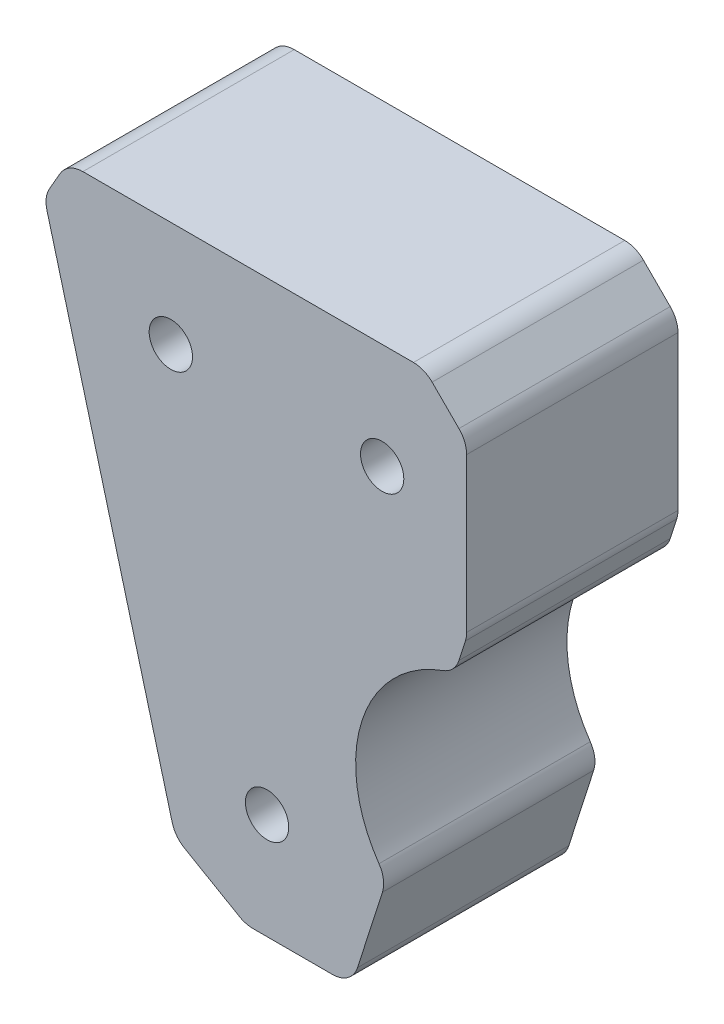
ISO-10303-21;
HEADER;
FILE_DESCRIPTION(('STEP AP214'),'2;1');
FILE_NAME('part.step','',(''),(''),'','','');
FILE_SCHEMA(('AUTOMOTIVE_DESIGN { 1 0 10303 214 1 1 1 1 }'));
ENDSEC;
DATA;
#1=APPLICATION_CONTEXT('core data for automotive mechanical design processes');
#2=APPLICATION_PROTOCOL_DEFINITION('international standard','automotive_design',2000,#1);
#3=PRODUCT_CONTEXT('',#1,'mechanical');
#4=PRODUCT('Part','Part','',(#3));
#5=PRODUCT_RELATED_PRODUCT_CATEGORY('part','',(#4));
#6=PRODUCT_DEFINITION_FORMATION('','',#4);
#7=PRODUCT_DEFINITION_CONTEXT('part definition',#1,'design');
#8=PRODUCT_DEFINITION('design','',#6,#7);
#9=PRODUCT_DEFINITION_SHAPE('','',#8);
#10=(LENGTH_UNIT() NAMED_UNIT(*) SI_UNIT(.MILLI.,.METRE.));
#11=(NAMED_UNIT(*) PLANE_ANGLE_UNIT() SI_UNIT($,.RADIAN.));
#12=(NAMED_UNIT(*) SI_UNIT($,.STERADIAN.) SOLID_ANGLE_UNIT());
#13=UNCERTAINTY_MEASURE_WITH_UNIT(LENGTH_MEASURE(1.E-05),#10,'distance_accuracy_value','');
#14=(GEOMETRIC_REPRESENTATION_CONTEXT(3) GLOBAL_UNCERTAINTY_ASSIGNED_CONTEXT((#13)) GLOBAL_UNIT_ASSIGNED_CONTEXT((#10,
#11,#12)) REPRESENTATION_CONTEXT('',''));
#15=CARTESIAN_POINT('',(0.,0.,0.));
#16=DIRECTION('',(0.,0.,1.));
#17=DIRECTION('',(1.,0.,0.));
#18=AXIS2_PLACEMENT_3D('',#15,#16,#17);
#19=CARTESIAN_POINT('',(28.,-10.,10.));
#20=DIRECTION('',(-0.95234502441364,0.305022875330005,0.));
#21=DIRECTION('',(-0.305022875330005,-0.95234502441364,0.));
#22=AXIS2_PLACEMENT_3D('',#19,#20,#21);
#23=PLANE('',#22);
#24=DIRECTION('',(0.305022875330005,0.95234502441364,0.));
#25=VECTOR('',#24,1.);
#26=CARTESIAN_POINT('',(28.,-10.,-10.));
#27=LINE('',#26,#25);
#28=CARTESIAN_POINT('',(17.6667513277127,-42.262557188325,-10.));
#29=VERTEX_POINT('',#28);
#30=CARTESIAN_POINT('',(20.0249138794989,-34.8998819446324,-10.));
#31=VERTEX_POINT('',#30);
#32=EDGE_CURVE('E191',#29,#31,#27,.T.);
#33=ORIENTED_EDGE('',*,*,#32,.T.);
#34=DIRECTION('',(0.,0.,1.));
#35=VECTOR('',#34,1.);
#36=CARTESIAN_POINT('',(20.0249138794989,-34.8998819446324,10.));
#37=LINE('',#36,#35);
#38=CARTESIAN_POINT('',(20.0249138794989,-34.8998819446324,10.));
#39=VERTEX_POINT('',#38);
#40=EDGE_CURVE('E195',#31,#39,#37,.T.);
#41=ORIENTED_EDGE('',*,*,#40,.T.);
#42=DIRECTION('',(0.305022875330005,0.95234502441364,0.));
#43=VECTOR('',#42,1.);
#44=CARTESIAN_POINT('',(28.,-10.,10.));
#45=LINE('',#44,#43);
#46=CARTESIAN_POINT('',(17.6667513277127,-42.262557188325,10.));
#47=VERTEX_POINT('',#46);
#48=EDGE_CURVE('E194',#47,#39,#45,.T.);
#49=ORIENTED_EDGE('',*,*,#48,.F.);
#50=DIRECTION('',(0.,0.,-1.));
#51=VECTOR('',#50,1.);
#52=CARTESIAN_POINT('',(17.6667513277127,-42.262557188325,10.));
#53=LINE('',#52,#51);
#54=EDGE_CURVE('E180',#47,#29,#53,.T.);
#55=ORIENTED_EDGE('',*,*,#54,.T.);
#56=EDGE_LOOP('',(#33,#41,#49,#55));
#57=FACE_BOUND('',#56,.T.);
#58=ADVANCED_FACE('F37',(#57),#23,.F.);
#59=CARTESIAN_POINT('',(0.,0.,10.));
#60=DIRECTION('',(0.,0.,1.));
#61=DIRECTION('',(1.,0.,0.));
#62=AXIS2_PLACEMENT_3D('',#59,#60,#61);
#63=PLANE('',#62);
#64=ORIENTED_EDGE('',*,*,#48,.T.);
#65=CARTESIAN_POINT('',(17.6440513184648,-34.1373247563074,10.));
#66=DIRECTION('',(0.,0.,1.));
#67=DIRECTION('',(1.,0.,0.));
#68=AXIS2_PLACEMENT_3D('',#65,#66,#67);
#69=CIRCLE('',#68,2.5);
#70=CARTESIAN_POINT('',(19.7019993228416,-32.7178706319054,10.));
#71=VERTEX_POINT('',#70);
#72=EDGE_CURVE('E257',#39,#71,#69,.T.);
#73=ORIENTED_EDGE('',*,*,#72,.T.);
#74=CARTESIAN_POINT('',(29.9917393447254,-25.6206000098957,10.));
#75=DIRECTION('',(0.,0.,1.));
#76=DIRECTION('',(1.,0.,0.));
#77=AXIS2_PLACEMENT_3D('',#74,#75,#76);
#78=CIRCLE('',#77,12.5);
#79=CARTESIAN_POINT('',(25.7400225826702,-13.865902881715,10.));
#80=VERTEX_POINT('',#79);
#81=EDGE_CURVE('E418',#80,#71,#78,.T.);
#82=ORIENTED_EDGE('',*,*,#81,.F.);
#83=CARTESIAN_POINT('',(24.8896792302592,-11.5149634560789,10.));
#84=DIRECTION('',(0.,0.,1.));
#85=DIRECTION('',(1.,0.,0.));
#86=AXIS2_PLACEMENT_3D('',#83,#84,#85);
#87=CIRCLE('',#86,2.5);
#88=CARTESIAN_POINT('',(27.2705417912933,-12.2775206444039,10.));
#89=VERTEX_POINT('',#88);
#90=EDGE_CURVE('E255',#80,#89,#87,.T.);
#91=ORIENTED_EDGE('',*,*,#90,.T.);
#92=CARTESIAN_POINT('',(27.8808625610341,-10.3719719286555,10.));
#93=VERTEX_POINT('',#92);
#94=EDGE_CURVE('E221',#89,#93,#45,.T.);
#95=ORIENTED_EDGE('',*,*,#94,.T.);
#96=CARTESIAN_POINT('',(25.5,-9.60941474033052,10.));
#97=DIRECTION('',(0.,0.,1.));
#98=DIRECTION('',(1.,0.,0.));
#99=AXIS2_PLACEMENT_3D('',#96,#97,#98);
#100=CIRCLE('',#99,2.5);
#101=CARTESIAN_POINT('',(28.,-9.60941474033052,10.));
#102=VERTEX_POINT('',#101);
#103=EDGE_CURVE('E253',#93,#102,#100,.T.);
#104=ORIENTED_EDGE('',*,*,#103,.T.);
#105=DIRECTION('',(0.,1.,0.));
#106=VECTOR('',#105,1.);
#107=CARTESIAN_POINT('',(28.,-10.,10.));
#108=LINE('',#107,#106);
#109=CARTESIAN_POINT('',(28.,4.96446609406727,10.));
#110=VERTEX_POINT('',#109);
#111=EDGE_CURVE('E324',#102,#110,#108,.T.);
#112=ORIENTED_EDGE('',*,*,#111,.T.);
#113=CARTESIAN_POINT('',(25.5,4.96446609406727,10.));
#114=DIRECTION('',(0.,0.,1.));
#115=DIRECTION('',(1.,0.,0.));
#116=AXIS2_PLACEMENT_3D('',#113,#114,#115);
#117=CIRCLE('',#116,2.5);
#118=CARTESIAN_POINT('',(27.2677669529664,6.73223304703364,10.));
#119=VERTEX_POINT('',#118);
#120=EDGE_CURVE('E241',#110,#119,#117,.T.);
#121=ORIENTED_EDGE('',*,*,#120,.T.);
#122=DIRECTION('',(0.707106781186548,-0.707106781186547,0.));
#123=VECTOR('',#122,1.);
#124=CARTESIAN_POINT('',(17.,17.,10.));
#125=LINE('',#124,#123);
#126=CARTESIAN_POINT('',(24.7322330470336,9.26776695296637,10.));
#127=VERTEX_POINT('',#126);
#128=EDGE_CURVE('E196',#119,#127,#125,.F.);
#129=ORIENTED_EDGE('',*,*,#128,.T.);
#130=CARTESIAN_POINT('',(22.9644660940673,7.5,10.));
#131=DIRECTION('',(0.,0.,1.));
#132=DIRECTION('',(1.,0.,0.));
#133=AXIS2_PLACEMENT_3D('',#130,#131,#132);
#134=CIRCLE('',#133,2.5);
#135=CARTESIAN_POINT('',(22.9644660940673,10.,10.));
#136=VERTEX_POINT('',#135);
#137=EDGE_CURVE('E243',#127,#136,#134,.T.);
#138=ORIENTED_EDGE('',*,*,#137,.T.);
#139=DIRECTION('',(-1.,0.,0.));
#140=VECTOR('',#139,1.);
#141=CARTESIAN_POINT('',(-13.032253728412,10.,10.));
#142=LINE('',#141,#140);
#143=CARTESIAN_POINT('',(-8.32289173172706,10.,10.));
#144=VERTEX_POINT('',#143);
#145=EDGE_CURVE('E330',#136,#144,#142,.T.);
#146=ORIENTED_EDGE('',*,*,#145,.T.);
#147=CARTESIAN_POINT('',(-8.32289173172706,7.5,10.));
#148=DIRECTION('',(0.,0.,1.));
#149=DIRECTION('',(1.,0.,0.));
#150=AXIS2_PLACEMENT_3D('',#147,#148,#149);
#151=CIRCLE('',#150,2.5);
#152=CARTESIAN_POINT('',(-10.4879552411882,8.75,10.));
#153=VERTEX_POINT('',#152);
#154=EDGE_CURVE('E245',#144,#153,#151,.T.);
#155=ORIENTED_EDGE('',*,*,#154,.T.);
#156=DIRECTION('',(0.500000000000001,0.866025403784438,0.));
#157=VECTOR('',#156,1.);
#158=CARTESIAN_POINT('',(-11.654827572448,6.72891783631156,10.));
#159=LINE('',#158,#157);
#160=CARTESIAN_POINT('',(-11.4792105950356,7.0330953638616,10.));
#161=VERTEX_POINT('',#160);
#162=EDGE_CURVE('E233',#153,#161,#159,.F.);
#163=ORIENTED_EDGE('',*,*,#162,.T.);
#164=CARTESIAN_POINT('',(-9.31414708557448,5.7830953638616,10.));
#165=DIRECTION('',(0.,0.,1.));
#166=DIRECTION('',(1.,0.,0.));
#167=AXIS2_PLACEMENT_3D('',#164,#165,#166);
#168=CIRCLE('',#167,2.5);
#169=CARTESIAN_POINT('',(-11.7289616512972,5.13604775110531,10.));
#170=VERTEX_POINT('',#169);
#171=EDGE_CURVE('E239',#161,#170,#168,.T.);
#172=ORIENTED_EDGE('',*,*,#171,.T.);
#173=DIRECTION('',(0.258819045102518,-0.965925826289069,0.));
#174=VECTOR('',#173,1.);
#175=CARTESIAN_POINT('',(-13.032253728412,10.,10.));
#176=LINE('',#175,#174);
#177=CARTESIAN_POINT('',(0.133710585753566,-39.1360477511053,10.));
#178=VERTEX_POINT('',#177);
#179=EDGE_CURVE('E333',#170,#178,#176,.T.);
#180=ORIENTED_EDGE('',*,*,#179,.T.);
#181=CARTESIAN_POINT('',(2.54852515147625,-38.489000138349,10.));
#182=DIRECTION('',(0.,0.,1.));
#183=DIRECTION('',(1.,0.,0.));
#184=AXIS2_PLACEMENT_3D('',#181,#182,#183);
#185=CIRCLE('',#184,2.5);
#186=CARTESIAN_POINT('',(1.29852515147624,-40.6540636478101,10.));
#187=VERTEX_POINT('',#186);
#188=EDGE_CURVE('E247',#178,#187,#185,.T.);
#189=ORIENTED_EDGE('',*,*,#188,.T.);
#190=DIRECTION('',(-0.866025403784437,0.500000000000004,0.));
#191=VECTOR('',#190,1.);
#192=CARTESIAN_POINT('',(-17.2790946551675,-29.9282698515417,10.));
#193=LINE('',#192,#191);
#194=CARTESIAN_POINT('',(6.51372989343859,-43.6650635094611,10.));
#195=VERTEX_POINT('',#194);
#196=EDGE_CURVE('E230',#187,#195,#193,.F.);
#197=ORIENTED_EDGE('',*,*,#196,.T.);
#198=CARTESIAN_POINT('',(7.7637298934386,-41.5,10.));
#199=DIRECTION('',(0.,0.,1.));
#200=DIRECTION('',(1.,0.,0.));
#201=AXIS2_PLACEMENT_3D('',#198,#199,#200);
#202=CIRCLE('',#201,2.5);
#203=CARTESIAN_POINT('',(7.7637298934386,-44.,10.));
#204=VERTEX_POINT('',#203);
#205=EDGE_CURVE('E249',#195,#204,#202,.T.);
#206=ORIENTED_EDGE('',*,*,#205,.T.);
#207=DIRECTION('',(1.,0.,0.));
#208=VECTOR('',#207,1.);
#209=CARTESIAN_POINT('',(1.43700266286844,-44.,10.));
#210=LINE('',#209,#208);
#211=CARTESIAN_POINT('',(15.2858887666786,-44.,10.));
#212=VERTEX_POINT('',#211);
#213=EDGE_CURVE('E211',#204,#212,#210,.T.);
#214=ORIENTED_EDGE('',*,*,#213,.T.);
#215=CARTESIAN_POINT('',(15.2858887666786,-41.5,10.));
#216=DIRECTION('',(0.,0.,1.));
#217=DIRECTION('',(1.,0.,0.));
#218=AXIS2_PLACEMENT_3D('',#215,#216,#217);
#219=CIRCLE('',#218,2.5);
#220=EDGE_CURVE('E251',#212,#47,#219,.T.);
#221=ORIENTED_EDGE('',*,*,#220,.T.);
#222=EDGE_LOOP('',(#64,#73,#82,#91,#95,#104,#112,#121,#129,#138,#146,#155,#163,#172,#180,#189,
#197,#206,#214,#221));
#223=FACE_BOUND('',#222,.T.);
#224=CARTESIAN_POINT('',(20.,0.,10.));
#225=DIRECTION('',(0.,0.,1.));
#226=DIRECTION('',(1.,0.,0.));
#227=AXIS2_PLACEMENT_3D('',#224,#225,#226);
#228=CIRCLE('',#227,2.05);
#229=CARTESIAN_POINT('',(22.05,0.,10.));
#230=VERTEX_POINT('',#229);
#231=EDGE_CURVE('E428',#230,#230,#228,.T.);
#232=ORIENTED_EDGE('',*,*,#231,.F.);
#233=EDGE_LOOP('',(#232));
#234=FACE_BOUND('',#233,.T.);
#235=CARTESIAN_POINT('',(0.,0.,10.));
#236=DIRECTION('',(0.,0.,1.));
#237=DIRECTION('',(1.,0.,0.));
#238=AXIS2_PLACEMENT_3D('',#235,#236,#237);
#239=CIRCLE('',#238,2.05);
#240=CARTESIAN_POINT('',(2.05,0.,10.));
#241=VERTEX_POINT('',#240);
#242=EDGE_CURVE('E209',#241,#241,#239,.T.);
#243=ORIENTED_EDGE('',*,*,#242,.F.);
#244=EDGE_LOOP('',(#243));
#245=FACE_BOUND('',#244,.T.);
#246=CARTESIAN_POINT('',(9.11027254265807,-34.,10.));
#247=DIRECTION('',(0.,0.,1.));
#248=DIRECTION('',(1.,0.,0.));
#249=AXIS2_PLACEMENT_3D('',#246,#247,#248);
#250=CIRCLE('',#249,2.05);
#251=CARTESIAN_POINT('',(11.1602725426581,-34.,10.));
#252=VERTEX_POINT('',#251);
#253=EDGE_CURVE('E421',#252,#252,#250,.T.);
#254=ORIENTED_EDGE('',*,*,#253,.F.);
#255=EDGE_LOOP('',(#254));
#256=FACE_BOUND('',#255,.T.);
#257=ADVANCED_FACE('F326',(#223,#234,#245,#256),#63,.T.);
#258=CARTESIAN_POINT('',(0.,0.,-10.));
#259=DIRECTION('',(0.,0.,1.));
#260=DIRECTION('',(1.,0.,0.));
#261=AXIS2_PLACEMENT_3D('',#258,#259,#260);
#262=PLANE('',#261);
#263=CARTESIAN_POINT('',(29.9917393447254,-25.6206000098957,-10.));
#264=DIRECTION('',(0.,0.,1.));
#265=DIRECTION('',(1.,0.,0.));
#266=AXIS2_PLACEMENT_3D('',#263,#264,#265);
#267=CIRCLE('',#266,12.5);
#268=CARTESIAN_POINT('',(25.7400225826702,-13.865902881715,-10.));
#269=VERTEX_POINT('',#268);
#270=CARTESIAN_POINT('',(19.7019993228416,-32.7178706319054,-10.));
#271=VERTEX_POINT('',#270);
#272=EDGE_CURVE('E411',#269,#271,#267,.T.);
#273=ORIENTED_EDGE('',*,*,#272,.T.);
#274=CARTESIAN_POINT('',(17.6440513184648,-34.1373247563074,-10.));
#275=DIRECTION('',(0.,0.,1.));
#276=DIRECTION('',(1.,0.,0.));
#277=AXIS2_PLACEMENT_3D('',#274,#275,#276);
#278=CIRCLE('',#277,2.5);
#279=EDGE_CURVE('E202',#271,#31,#278,.F.);
#280=ORIENTED_EDGE('',*,*,#279,.T.);
#281=ORIENTED_EDGE('',*,*,#32,.F.);
#282=CARTESIAN_POINT('',(15.2858887666786,-41.5,-10.));
#283=DIRECTION('',(0.,0.,1.));
#284=DIRECTION('',(1.,0.,0.));
#285=AXIS2_PLACEMENT_3D('',#282,#283,#284);
#286=CIRCLE('',#285,2.5);
#287=CARTESIAN_POINT('',(15.2858887666786,-44.,-10.));
#288=VERTEX_POINT('',#287);
#289=EDGE_CURVE('E176',#29,#288,#286,.F.);
#290=ORIENTED_EDGE('',*,*,#289,.T.);
#291=DIRECTION('',(1.,0.,0.));
#292=VECTOR('',#291,1.);
#293=CARTESIAN_POINT('',(1.43700266286844,-44.,-10.));
#294=LINE('',#293,#292);
#295=CARTESIAN_POINT('',(7.7637298934386,-44.,-10.));
#296=VERTEX_POINT('',#295);
#297=EDGE_CURVE('E219',#296,#288,#294,.T.);
#298=ORIENTED_EDGE('',*,*,#297,.F.);
#299=CARTESIAN_POINT('',(7.7637298934386,-41.5,-10.));
#300=DIRECTION('',(0.,0.,1.));
#301=DIRECTION('',(1.,0.,0.));
#302=AXIS2_PLACEMENT_3D('',#299,#300,#301);
#303=CIRCLE('',#302,2.5);
#304=CARTESIAN_POINT('',(6.51372989343859,-43.6650635094611,-10.));
#305=VERTEX_POINT('',#304);
#306=EDGE_CURVE('E185',#296,#305,#303,.F.);
#307=ORIENTED_EDGE('',*,*,#306,.T.);
#308=DIRECTION('',(0.866025403784437,-0.500000000000004,0.));
#309=VECTOR('',#308,1.);
#310=CARTESIAN_POINT('',(7.09385691236078,-44.,-10.));
#311=LINE('',#310,#309);
#312=CARTESIAN_POINT('',(1.29852515147623,-40.6540636478101,-10.));
#313=VERTEX_POINT('',#312);
#314=EDGE_CURVE('E222',#305,#313,#311,.F.);
#315=ORIENTED_EDGE('',*,*,#314,.T.);
#316=CARTESIAN_POINT('',(2.54852515147625,-38.489000138349,-10.));
#317=DIRECTION('',(0.,0.,1.));
#318=DIRECTION('',(1.,0.,0.));
#319=AXIS2_PLACEMENT_3D('',#316,#317,#318);
#320=CIRCLE('',#319,2.5);
#321=CARTESIAN_POINT('',(0.133710585753566,-39.1360477511053,-10.));
#322=VERTEX_POINT('',#321);
#323=EDGE_CURVE('E270',#313,#322,#320,.F.);
#324=ORIENTED_EDGE('',*,*,#323,.T.);
#325=DIRECTION('',(0.258819045102518,-0.965925826289069,0.));
#326=VECTOR('',#325,1.);
#327=CARTESIAN_POINT('',(-13.032253728412,10.,-10.));
#328=LINE('',#327,#326);
#329=CARTESIAN_POINT('',(-11.7289616512972,5.13604775110531,-10.));
#330=VERTEX_POINT('',#329);
#331=EDGE_CURVE('E216',#330,#322,#328,.T.);
#332=ORIENTED_EDGE('',*,*,#331,.F.);
#333=CARTESIAN_POINT('',(-9.31414708557448,5.7830953638616,-10.));
#334=DIRECTION('',(0.,0.,1.));
#335=DIRECTION('',(1.,0.,0.));
#336=AXIS2_PLACEMENT_3D('',#333,#334,#335);
#337=CIRCLE('',#336,2.5);
#338=CARTESIAN_POINT('',(-11.4792105950356,7.0330953638616,-10.));
#339=VERTEX_POINT('',#338);
#340=EDGE_CURVE('E263',#330,#339,#337,.F.);
#341=ORIENTED_EDGE('',*,*,#340,.T.);
#342=DIRECTION('',(-0.500000000000001,-0.866025403784438,0.));
#343=VECTOR('',#342,1.);
#344=CARTESIAN_POINT('',(-11.9969775480019,6.13629669484373,-10.));
#345=LINE('',#344,#343);
#346=CARTESIAN_POINT('',(-10.4879552411882,8.75,-10.));
#347=VERTEX_POINT('',#346);
#348=EDGE_CURVE('E225',#339,#347,#345,.F.);
#349=ORIENTED_EDGE('',*,*,#348,.T.);
#350=CARTESIAN_POINT('',(-8.32289173172706,7.5,-10.));
#351=DIRECTION('',(0.,0.,1.));
#352=DIRECTION('',(1.,0.,0.));
#353=AXIS2_PLACEMENT_3D('',#350,#351,#352);
#354=CIRCLE('',#353,2.5);
#355=CARTESIAN_POINT('',(-8.32289173172706,10.,-10.));
#356=VERTEX_POINT('',#355);
#357=EDGE_CURVE('E268',#347,#356,#354,.F.);
#358=ORIENTED_EDGE('',*,*,#357,.T.);
#359=DIRECTION('',(-1.,0.,0.));
#360=VECTOR('',#359,1.);
#361=CARTESIAN_POINT('',(-13.032253728412,10.,-10.));
#362=LINE('',#361,#360);
#363=CARTESIAN_POINT('',(22.9644660940673,10.,-10.));
#364=VERTEX_POINT('',#363);
#365=EDGE_CURVE('E206',#364,#356,#362,.T.);
#366=ORIENTED_EDGE('',*,*,#365,.F.);
#367=CARTESIAN_POINT('',(22.9644660940673,7.5,-10.));
#368=DIRECTION('',(0.,0.,1.));
#369=DIRECTION('',(1.,0.,0.));
#370=AXIS2_PLACEMENT_3D('',#367,#368,#369);
#371=CIRCLE('',#370,2.5);
#372=CARTESIAN_POINT('',(24.7322330470336,9.26776695296637,-10.));
#373=VERTEX_POINT('',#372);
#374=EDGE_CURVE('E266',#364,#373,#371,.F.);
#375=ORIENTED_EDGE('',*,*,#374,.T.);
#376=DIRECTION('',(-0.707106781186548,0.707106781186547,0.));
#377=VECTOR('',#376,1.);
#378=CARTESIAN_POINT('',(24.,10.,-10.));
#379=LINE('',#378,#377);
#380=CARTESIAN_POINT('',(27.2677669529664,6.73223304703364,-10.));
#381=VERTEX_POINT('',#380);
#382=EDGE_CURVE('E228',#373,#381,#379,.F.);
#383=ORIENTED_EDGE('',*,*,#382,.T.);
#384=CARTESIAN_POINT('',(25.5,4.96446609406727,-10.));
#385=DIRECTION('',(0.,0.,1.));
#386=DIRECTION('',(1.,0.,0.));
#387=AXIS2_PLACEMENT_3D('',#384,#385,#386);
#388=CIRCLE('',#387,2.5);
#389=CARTESIAN_POINT('',(28.,4.96446609406727,-10.));
#390=VERTEX_POINT('',#389);
#391=EDGE_CURVE('E52',#381,#390,#388,.F.);
#392=ORIENTED_EDGE('',*,*,#391,.T.);
#393=DIRECTION('',(0.,1.,0.));
#394=VECTOR('',#393,1.);
#395=CARTESIAN_POINT('',(28.,-10.,-10.));
#396=LINE('',#395,#394);
#397=CARTESIAN_POINT('',(28.,-9.60941474033052,-10.));
#398=VERTEX_POINT('',#397);
#399=EDGE_CURVE('E203',#398,#390,#396,.T.);
#400=ORIENTED_EDGE('',*,*,#399,.F.);
#401=CARTESIAN_POINT('',(25.5,-9.60941474033052,-10.));
#402=DIRECTION('',(0.,0.,1.));
#403=DIRECTION('',(1.,0.,0.));
#404=AXIS2_PLACEMENT_3D('',#401,#402,#403);
#405=CIRCLE('',#404,2.5);
#406=CARTESIAN_POINT('',(27.8808625610341,-10.3719719286555,-10.));
#407=VERTEX_POINT('',#406);
#408=EDGE_CURVE('E60',#398,#407,#405,.F.);
#409=ORIENTED_EDGE('',*,*,#408,.T.);
#410=CARTESIAN_POINT('',(27.2705417912933,-12.2775206444039,-10.));
#411=VERTEX_POINT('',#410);
#412=EDGE_CURVE('E204',#411,#407,#27,.T.);
#413=ORIENTED_EDGE('',*,*,#412,.F.);
#414=CARTESIAN_POINT('',(24.8896792302592,-11.5149634560789,-10.));
#415=DIRECTION('',(0.,0.,1.));
#416=DIRECTION('',(1.,0.,0.));
#417=AXIS2_PLACEMENT_3D('',#414,#415,#416);
#418=CIRCLE('',#417,2.5);
#419=EDGE_CURVE('E274',#411,#269,#418,.F.);
#420=ORIENTED_EDGE('',*,*,#419,.T.);
#421=EDGE_LOOP('',(#273,#280,#281,#290,#298,#307,#315,#324,#332,#341,#349,#358,#366,#375,#383,
#392,#400,#409,#413,#420));
#422=FACE_BOUND('',#421,.T.);
#423=CARTESIAN_POINT('',(0.,0.,-10.));
#424=DIRECTION('',(0.,0.,1.));
#425=DIRECTION('',(1.,0.,0.));
#426=AXIS2_PLACEMENT_3D('',#423,#424,#425);
#427=CIRCLE('',#426,2.05);
#428=CARTESIAN_POINT('',(2.05,0.,-10.));
#429=VERTEX_POINT('',#428);
#430=EDGE_CURVE('E431',#429,#429,#427,.T.);
#431=ORIENTED_EDGE('',*,*,#430,.T.);
#432=EDGE_LOOP('',(#431));
#433=FACE_BOUND('',#432,.T.);
#434=CARTESIAN_POINT('',(20.,0.,-10.));
#435=DIRECTION('',(0.,0.,1.));
#436=DIRECTION('',(1.,0.,0.));
#437=AXIS2_PLACEMENT_3D('',#434,#435,#436);
#438=CIRCLE('',#437,2.05);
#439=CARTESIAN_POINT('',(22.05,0.,-10.));
#440=VERTEX_POINT('',#439);
#441=EDGE_CURVE('E426',#440,#440,#438,.T.);
#442=ORIENTED_EDGE('',*,*,#441,.T.);
#443=EDGE_LOOP('',(#442));
#444=FACE_BOUND('',#443,.T.);
#445=CARTESIAN_POINT('',(9.11027254265807,-34.,-10.));
#446=DIRECTION('',(0.,0.,1.));
#447=DIRECTION('',(1.,0.,0.));
#448=AXIS2_PLACEMENT_3D('',#445,#446,#447);
#449=CIRCLE('',#448,2.05);
#450=CARTESIAN_POINT('',(11.1602725426581,-34.,-10.));
#451=VERTEX_POINT('',#450);
#452=EDGE_CURVE('E417',#451,#451,#449,.T.);
#453=ORIENTED_EDGE('',*,*,#452,.T.);
#454=EDGE_LOOP('',(#453));
#455=FACE_BOUND('',#454,.T.);
#456=ADVANCED_FACE('F199',(#422,#433,#444,#455),#262,.F.);
#457=ORIENTED_EDGE('',*,*,#94,.F.);
#458=DIRECTION('',(0.,0.,1.));
#459=VECTOR('',#458,1.);
#460=CARTESIAN_POINT('',(27.2705417912933,-12.2775206444039,10.));
#461=LINE('',#460,#459);
#462=EDGE_CURVE('E279',#89,#411,#461,.F.);
#463=ORIENTED_EDGE('',*,*,#462,.T.);
#464=ORIENTED_EDGE('',*,*,#412,.T.);
#465=DIRECTION('',(0.,0.,-1.));
#466=VECTOR('',#465,1.);
#467=CARTESIAN_POINT('',(27.8808625610341,-10.3719719286555,10.));
#468=LINE('',#467,#466);
#469=EDGE_CURVE('E277',#407,#93,#468,.F.);
#470=ORIENTED_EDGE('',*,*,#469,.T.);
#471=EDGE_LOOP('',(#457,#463,#464,#470));
#472=FACE_BOUND('',#471,.T.);
#473=ADVANCED_FACE('F389',(#472),#23,.F.);
#474=CARTESIAN_POINT('',(28.,-10.,10.));
#475=DIRECTION('',(-1.,0.,0.));
#476=DIRECTION('',(0.,0.,1.));
#477=AXIS2_PLACEMENT_3D('',#474,#475,#476);
#478=PLANE('',#477);
#479=ORIENTED_EDGE('',*,*,#111,.F.);
#480=DIRECTION('',(0.,0.,-1.));
#481=VECTOR('',#480,1.);
#482=CARTESIAN_POINT('',(28.,-9.60941474033052,10.));
#483=LINE('',#482,#481);
#484=EDGE_CURVE('E285',#102,#398,#483,.T.);
#485=ORIENTED_EDGE('',*,*,#484,.T.);
#486=ORIENTED_EDGE('',*,*,#399,.T.);
#487=DIRECTION('',(0.,0.,-1.));
#488=VECTOR('',#487,1.);
#489=CARTESIAN_POINT('',(28.,4.96446609406727,10.));
#490=LINE('',#489,#488);
#491=EDGE_CURVE('E282',#390,#110,#490,.F.);
#492=ORIENTED_EDGE('',*,*,#491,.T.);
#493=EDGE_LOOP('',(#479,#485,#486,#492));
#494=FACE_BOUND('',#493,.T.);
#495=ADVANCED_FACE('F323',(#494),#478,.F.);
#496=CARTESIAN_POINT('',(-13.032253728412,10.,10.));
#497=DIRECTION('',(0.,-1.,0.));
#498=DIRECTION('',(0.,0.,-1.));
#499=AXIS2_PLACEMENT_3D('',#496,#497,#498);
#500=PLANE('',#499);
#501=ORIENTED_EDGE('',*,*,#365,.T.);
#502=DIRECTION('',(0.,0.,-1.));
#503=VECTOR('',#502,1.);
#504=CARTESIAN_POINT('',(-8.32289173172706,10.,10.));
#505=LINE('',#504,#503);
#506=EDGE_CURVE('E304',#356,#144,#505,.F.);
#507=ORIENTED_EDGE('',*,*,#506,.T.);
#508=ORIENTED_EDGE('',*,*,#145,.F.);
#509=DIRECTION('',(0.,0.,1.));
#510=VECTOR('',#509,1.);
#511=CARTESIAN_POINT('',(22.9644660940673,10.,-10.));
#512=LINE('',#511,#510);
#513=EDGE_CURVE('E301',#136,#364,#512,.F.);
#514=ORIENTED_EDGE('',*,*,#513,.T.);
#515=EDGE_LOOP('',(#501,#507,#508,#514));
#516=FACE_BOUND('',#515,.T.);
#517=ADVANCED_FACE('F374',(#516),#500,.F.);
#518=CARTESIAN_POINT('',(-13.032253728412,10.,10.));
#519=DIRECTION('',(0.965925826289069,0.258819045102518,0.));
#520=DIRECTION('',(-0.258819045102518,0.965925826289069,0.));
#521=AXIS2_PLACEMENT_3D('',#518,#519,#520);
#522=PLANE('',#521);
#523=ORIENTED_EDGE('',*,*,#331,.T.);
#524=DIRECTION('',(0.,0.,-1.));
#525=VECTOR('',#524,1.);
#526=CARTESIAN_POINT('',(0.133710585753573,-39.1360477511053,10.));
#527=LINE('',#526,#525);
#528=EDGE_CURVE('E298',#322,#178,#527,.F.);
#529=ORIENTED_EDGE('',*,*,#528,.T.);
#530=ORIENTED_EDGE('',*,*,#179,.F.);
#531=DIRECTION('',(0.,0.,1.));
#532=VECTOR('',#531,1.);
#533=CARTESIAN_POINT('',(-11.7289616512972,5.1360477511053,-10.));
#534=LINE('',#533,#532);
#535=EDGE_CURVE('E295',#170,#330,#534,.F.);
#536=ORIENTED_EDGE('',*,*,#535,.T.);
#537=EDGE_LOOP('',(#523,#529,#530,#536));
#538=FACE_BOUND('',#537,.T.);
#539=ADVANCED_FACE('F359',(#538),#522,.F.);
#540=CARTESIAN_POINT('',(1.43700266286844,-44.,10.));
#541=DIRECTION('',(0.,1.,0.));
#542=DIRECTION('',(0.,0.,1.));
#543=AXIS2_PLACEMENT_3D('',#540,#541,#542);
#544=PLANE('',#543);
#545=ORIENTED_EDGE('',*,*,#297,.T.);
#546=DIRECTION('',(0.,0.,-1.));
#547=VECTOR('',#546,1.);
#548=CARTESIAN_POINT('',(15.2858887666786,-44.,10.));
#549=LINE('',#548,#547);
#550=EDGE_CURVE('E181',#288,#212,#549,.F.);
#551=ORIENTED_EDGE('',*,*,#550,.T.);
#552=ORIENTED_EDGE('',*,*,#213,.F.);
#553=DIRECTION('',(0.,0.,1.));
#554=VECTOR('',#553,1.);
#555=CARTESIAN_POINT('',(7.7637298934386,-44.,-10.));
#556=LINE('',#555,#554);
#557=EDGE_CURVE('E287',#204,#296,#556,.F.);
#558=ORIENTED_EDGE('',*,*,#557,.T.);
#559=EDGE_LOOP('',(#545,#551,#552,#558));
#560=FACE_BOUND('',#559,.T.);
#561=ADVANCED_FACE('F344',(#560),#544,.F.);
#562=CARTESIAN_POINT('',(0.,0.,10.));
#563=DIRECTION('',(0.,0.,-1.));
#564=DIRECTION('',(-1.,0.,0.));
#565=AXIS2_PLACEMENT_3D('',#562,#563,#564);
#566=CYLINDRICAL_SURFACE('',#565,2.05);
#567=ORIENTED_EDGE('',*,*,#242,.T.);
#568=EDGE_LOOP('',(#567));
#569=FACE_BOUND('',#568,.T.);
#570=ORIENTED_EDGE('',*,*,#430,.F.);
#571=EDGE_LOOP('',(#570));
#572=FACE_BOUND('',#571,.T.);
#573=ADVANCED_FACE('F439',(#569,#572),#566,.F.);
#574=CARTESIAN_POINT('',(20.,0.,10.));
#575=DIRECTION('',(0.,0.,-1.));
#576=DIRECTION('',(-1.,0.,0.));
#577=AXIS2_PLACEMENT_3D('',#574,#575,#576);
#578=CYLINDRICAL_SURFACE('',#577,2.05);
#579=ORIENTED_EDGE('',*,*,#231,.T.);
#580=EDGE_LOOP('',(#579));
#581=FACE_BOUND('',#580,.T.);
#582=ORIENTED_EDGE('',*,*,#441,.F.);
#583=EDGE_LOOP('',(#582));
#584=FACE_BOUND('',#583,.T.);
#585=ADVANCED_FACE('F441',(#581,#584),#578,.F.);
#586=CARTESIAN_POINT('',(9.11027254265807,-34.,10.));
#587=DIRECTION('',(0.,0.,-1.));
#588=DIRECTION('',(-1.,0.,0.));
#589=AXIS2_PLACEMENT_3D('',#586,#587,#588);
#590=CYLINDRICAL_SURFACE('',#589,2.05);
#591=ORIENTED_EDGE('',*,*,#253,.T.);
#592=EDGE_LOOP('',(#591));
#593=FACE_BOUND('',#592,.T.);
#594=ORIENTED_EDGE('',*,*,#452,.F.);
#595=EDGE_LOOP('',(#594));
#596=FACE_BOUND('',#595,.T.);
#597=ADVANCED_FACE('F448',(#593,#596),#590,.F.);
#598=CARTESIAN_POINT('',(24.,10.,10.));
#599=DIRECTION('',(-0.707106781186547,-0.707106781186548,0.));
#600=DIRECTION('',(0.,0.,-1.));
#601=AXIS2_PLACEMENT_3D('',#598,#599,#600);
#602=PLANE('',#601);
#603=ORIENTED_EDGE('',*,*,#382,.F.);
#604=DIRECTION('',(0.,0.,-1.));
#605=VECTOR('',#604,1.);
#606=CARTESIAN_POINT('',(24.7322330470336,9.26776695296637,10.));
#607=LINE('',#606,#605);
#608=EDGE_CURVE('E11',#373,#127,#607,.F.);
#609=ORIENTED_EDGE('',*,*,#608,.T.);
#610=ORIENTED_EDGE('',*,*,#128,.F.);
#611=DIRECTION('',(0.,0.,1.));
#612=VECTOR('',#611,1.);
#613=CARTESIAN_POINT('',(27.2677669529664,6.73223304703364,-10.));
#614=LINE('',#613,#612);
#615=EDGE_CURVE('E45',#119,#381,#614,.F.);
#616=ORIENTED_EDGE('',*,*,#615,.T.);
#617=EDGE_LOOP('',(#603,#609,#610,#616));
#618=FACE_BOUND('',#617,.T.);
#619=ADVANCED_FACE('F314',(#618),#602,.F.);
#620=CARTESIAN_POINT('',(-11.9969775480019,6.13629669484373,10.));
#621=DIRECTION('',(0.866025403784438,-0.500000000000001,0.));
#622=DIRECTION('',(0.,0.,-1.));
#623=AXIS2_PLACEMENT_3D('',#620,#621,#622);
#624=PLANE('',#623);
#625=ORIENTED_EDGE('',*,*,#162,.F.);
#626=DIRECTION('',(0.,0.,1.));
#627=VECTOR('',#626,1.);
#628=CARTESIAN_POINT('',(-10.4879552411882,8.75,-10.));
#629=LINE('',#628,#627);
#630=EDGE_CURVE('E309',#153,#347,#629,.F.);
#631=ORIENTED_EDGE('',*,*,#630,.T.);
#632=ORIENTED_EDGE('',*,*,#348,.F.);
#633=DIRECTION('',(0.,0.,-1.));
#634=VECTOR('',#633,1.);
#635=CARTESIAN_POINT('',(-11.4792105950356,7.0330953638616,10.));
#636=LINE('',#635,#634);
#637=EDGE_CURVE('E307',#339,#161,#636,.F.);
#638=ORIENTED_EDGE('',*,*,#637,.T.);
#639=EDGE_LOOP('',(#625,#631,#632,#638));
#640=FACE_BOUND('',#639,.T.);
#641=ADVANCED_FACE('F368',(#640),#624,.F.);
#642=CARTESIAN_POINT('',(7.09385691236078,-44.,10.));
#643=DIRECTION('',(0.500000000000004,0.866025403784436,0.));
#644=DIRECTION('',(0.,0.,-1.));
#645=AXIS2_PLACEMENT_3D('',#642,#643,#644);
#646=PLANE('',#645);
#647=ORIENTED_EDGE('',*,*,#314,.F.);
#648=DIRECTION('',(0.,0.,-1.));
#649=VECTOR('',#648,1.);
#650=CARTESIAN_POINT('',(6.51372989343859,-43.6650635094611,10.));
#651=LINE('',#650,#649);
#652=EDGE_CURVE('E293',#305,#195,#651,.F.);
#653=ORIENTED_EDGE('',*,*,#652,.T.);
#654=ORIENTED_EDGE('',*,*,#196,.F.);
#655=DIRECTION('',(0.,0.,1.));
#656=VECTOR('',#655,1.);
#657=CARTESIAN_POINT('',(1.29852515147623,-40.6540636478101,-10.));
#658=LINE('',#657,#656);
#659=EDGE_CURVE('E291',#187,#313,#658,.F.);
#660=ORIENTED_EDGE('',*,*,#659,.T.);
#661=EDGE_LOOP('',(#647,#653,#654,#660));
#662=FACE_BOUND('',#661,.T.);
#663=ADVANCED_FACE('F351',(#662),#646,.F.);
#664=CARTESIAN_POINT('',(29.9917393447254,-25.6206000098957,-10.));
#665=DIRECTION('',(0.,0.,1.));
#666=DIRECTION('',(1.,0.,0.));
#667=AXIS2_PLACEMENT_3D('',#664,#665,#666);
#668=CYLINDRICAL_SURFACE('',#667,12.5);
#669=ORIENTED_EDGE('',*,*,#81,.T.);
#670=DIRECTION('',(0.,0.,1.));
#671=VECTOR('',#670,1.);
#672=CARTESIAN_POINT('',(19.7019993228416,-32.7178706319054,-10.));
#673=LINE('',#672,#671);
#674=EDGE_CURVE('E261',#71,#271,#673,.F.);
#675=ORIENTED_EDGE('',*,*,#674,.T.);
#676=ORIENTED_EDGE('',*,*,#272,.F.);
#677=DIRECTION('',(0.,0.,1.));
#678=VECTOR('',#677,1.);
#679=CARTESIAN_POINT('',(25.7400225826702,-13.865902881715,-10.));
#680=LINE('',#679,#678);
#681=EDGE_CURVE('E259',#269,#80,#680,.T.);
#682=ORIENTED_EDGE('',*,*,#681,.T.);
#683=EDGE_LOOP('',(#669,#675,#676,#682));
#684=FACE_BOUND('',#683,.T.);
#685=ADVANCED_FACE('F414',(#684),#668,.F.);
#686=CARTESIAN_POINT('',(17.6440513184648,-34.1373247563074,-10.));
#687=DIRECTION('',(0.,0.,1.));
#688=DIRECTION('',(1.,0.,0.));
#689=AXIS2_PLACEMENT_3D('',#686,#687,#688);
#690=CYLINDRICAL_SURFACE('',#689,2.5);
#691=ORIENTED_EDGE('',*,*,#279,.F.);
#692=ORIENTED_EDGE('',*,*,#674,.F.);
#693=ORIENTED_EDGE('',*,*,#72,.F.);
#694=ORIENTED_EDGE('',*,*,#40,.F.);
#695=EDGE_LOOP('',(#691,#692,#693,#694));
#696=FACE_BOUND('',#695,.T.);
#697=ADVANCED_FACE('F505',(#696),#690,.T.);
#698=CARTESIAN_POINT('',(24.8896792302592,-11.5149634560789,-10.));
#699=DIRECTION('',(0.,0.,1.));
#700=DIRECTION('',(1.,0.,0.));
#701=AXIS2_PLACEMENT_3D('',#698,#699,#700);
#702=CYLINDRICAL_SURFACE('',#701,2.5);
#703=ORIENTED_EDGE('',*,*,#90,.F.);
#704=ORIENTED_EDGE('',*,*,#681,.F.);
#705=ORIENTED_EDGE('',*,*,#419,.F.);
#706=ORIENTED_EDGE('',*,*,#462,.F.);
#707=EDGE_LOOP('',(#703,#704,#705,#706));
#708=FACE_BOUND('',#707,.T.);
#709=ADVANCED_FACE('F408',(#708),#702,.T.);
#710=CARTESIAN_POINT('',(25.5,-9.60941474033052,10.));
#711=DIRECTION('',(0.,0.,-1.));
#712=DIRECTION('',(-1.,0.,0.));
#713=AXIS2_PLACEMENT_3D('',#710,#711,#712);
#714=CYLINDRICAL_SURFACE('',#713,2.5);
#715=ORIENTED_EDGE('',*,*,#103,.F.);
#716=ORIENTED_EDGE('',*,*,#469,.F.);
#717=ORIENTED_EDGE('',*,*,#408,.F.);
#718=ORIENTED_EDGE('',*,*,#484,.F.);
#719=EDGE_LOOP('',(#715,#716,#717,#718));
#720=FACE_BOUND('',#719,.T.);
#721=ADVANCED_FACE('F523',(#720),#714,.T.);
#722=CARTESIAN_POINT('',(15.2858887666786,-41.5,10.));
#723=DIRECTION('',(0.,0.,-1.));
#724=DIRECTION('',(-1.,0.,0.));
#725=AXIS2_PLACEMENT_3D('',#722,#723,#724);
#726=CYLINDRICAL_SURFACE('',#725,2.5);
#727=ORIENTED_EDGE('',*,*,#220,.F.);
#728=ORIENTED_EDGE('',*,*,#550,.F.);
#729=ORIENTED_EDGE('',*,*,#289,.F.);
#730=ORIENTED_EDGE('',*,*,#54,.F.);
#731=EDGE_LOOP('',(#727,#728,#729,#730));
#732=FACE_BOUND('',#731,.T.);
#733=ADVANCED_FACE('F179',(#732),#726,.T.);
#734=CARTESIAN_POINT('',(7.7637298934386,-41.5,10.));
#735=DIRECTION('',(0.,0.,-1.));
#736=DIRECTION('',(-1.,0.,0.));
#737=AXIS2_PLACEMENT_3D('',#734,#735,#736);
#738=CYLINDRICAL_SURFACE('',#737,2.5);
#739=ORIENTED_EDGE('',*,*,#205,.F.);
#740=ORIENTED_EDGE('',*,*,#652,.F.);
#741=ORIENTED_EDGE('',*,*,#306,.F.);
#742=ORIENTED_EDGE('',*,*,#557,.F.);
#743=EDGE_LOOP('',(#739,#740,#741,#742));
#744=FACE_BOUND('',#743,.T.);
#745=ADVANCED_FACE('F346',(#744),#738,.T.);
#746=CARTESIAN_POINT('',(2.54852515147625,-38.489000138349,10.));
#747=DIRECTION('',(0.,0.,1.));
#748=DIRECTION('',(1.,0.,0.));
#749=AXIS2_PLACEMENT_3D('',#746,#747,#748);
#750=CYLINDRICAL_SURFACE('',#749,2.5);
#751=ORIENTED_EDGE('',*,*,#323,.F.);
#752=ORIENTED_EDGE('',*,*,#659,.F.);
#753=ORIENTED_EDGE('',*,*,#188,.F.);
#754=ORIENTED_EDGE('',*,*,#528,.F.);
#755=EDGE_LOOP('',(#751,#752,#753,#754));
#756=FACE_BOUND('',#755,.T.);
#757=ADVANCED_FACE('F355',(#756),#750,.T.);
#758=CARTESIAN_POINT('',(-8.32289173172706,7.5,10.));
#759=DIRECTION('',(0.,0.,1.));
#760=DIRECTION('',(1.,0.,0.));
#761=AXIS2_PLACEMENT_3D('',#758,#759,#760);
#762=CYLINDRICAL_SURFACE('',#761,2.5);
#763=ORIENTED_EDGE('',*,*,#357,.F.);
#764=ORIENTED_EDGE('',*,*,#630,.F.);
#765=ORIENTED_EDGE('',*,*,#154,.F.);
#766=ORIENTED_EDGE('',*,*,#506,.F.);
#767=EDGE_LOOP('',(#763,#764,#765,#766));
#768=FACE_BOUND('',#767,.T.);
#769=ADVANCED_FACE('F371',(#768),#762,.T.);
#770=CARTESIAN_POINT('',(22.9644660940673,7.5,10.));
#771=DIRECTION('',(0.,0.,-1.));
#772=DIRECTION('',(-1.,0.,0.));
#773=AXIS2_PLACEMENT_3D('',#770,#771,#772);
#774=CYLINDRICAL_SURFACE('',#773,2.5);
#775=ORIENTED_EDGE('',*,*,#137,.F.);
#776=ORIENTED_EDGE('',*,*,#608,.F.);
#777=ORIENTED_EDGE('',*,*,#374,.F.);
#778=ORIENTED_EDGE('',*,*,#513,.F.);
#779=EDGE_LOOP('',(#775,#776,#777,#778));
#780=FACE_BOUND('',#779,.T.);
#781=ADVANCED_FACE('F379',(#780),#774,.T.);
#782=CARTESIAN_POINT('',(25.5,4.96446609406727,10.));
#783=DIRECTION('',(0.,0.,1.));
#784=DIRECTION('',(1.,0.,0.));
#785=AXIS2_PLACEMENT_3D('',#782,#783,#784);
#786=CYLINDRICAL_SURFACE('',#785,2.5);
#787=ORIENTED_EDGE('',*,*,#391,.F.);
#788=ORIENTED_EDGE('',*,*,#615,.F.);
#789=ORIENTED_EDGE('',*,*,#120,.F.);
#790=ORIENTED_EDGE('',*,*,#491,.F.);
#791=EDGE_LOOP('',(#787,#788,#789,#790));
#792=FACE_BOUND('',#791,.T.);
#793=ADVANCED_FACE('F319',(#792),#786,.T.);
#794=CARTESIAN_POINT('',(-9.31414708557448,5.7830953638616,10.));
#795=DIRECTION('',(0.,0.,-1.));
#796=DIRECTION('',(-1.,0.,0.));
#797=AXIS2_PLACEMENT_3D('',#794,#795,#796);
#798=CYLINDRICAL_SURFACE('',#797,2.5);
#799=ORIENTED_EDGE('',*,*,#171,.F.);
#800=ORIENTED_EDGE('',*,*,#637,.F.);
#801=ORIENTED_EDGE('',*,*,#340,.F.);
#802=ORIENTED_EDGE('',*,*,#535,.F.);
#803=EDGE_LOOP('',(#799,#800,#801,#802));
#804=FACE_BOUND('',#803,.T.);
#805=ADVANCED_FACE('F39',(#804),#798,.T.);
#806=CLOSED_SHELL('',(#58,#257,#456,#473,#495,#517,#539,#561,#573,#585,#597,#619,#641,#663,#685,
#697,#709,#721,#733,#745,#757,#769,#781,#793,#805));
#807=MANIFOLD_SOLID_BREP('B2',#806);
#808=ADVANCED_BREP_SHAPE_REPRESENTATION('',(#18,#807),#14);
#809=SHAPE_DEFINITION_REPRESENTATION(#9,#808);
ENDSEC;
END-ISO-10303-21;
